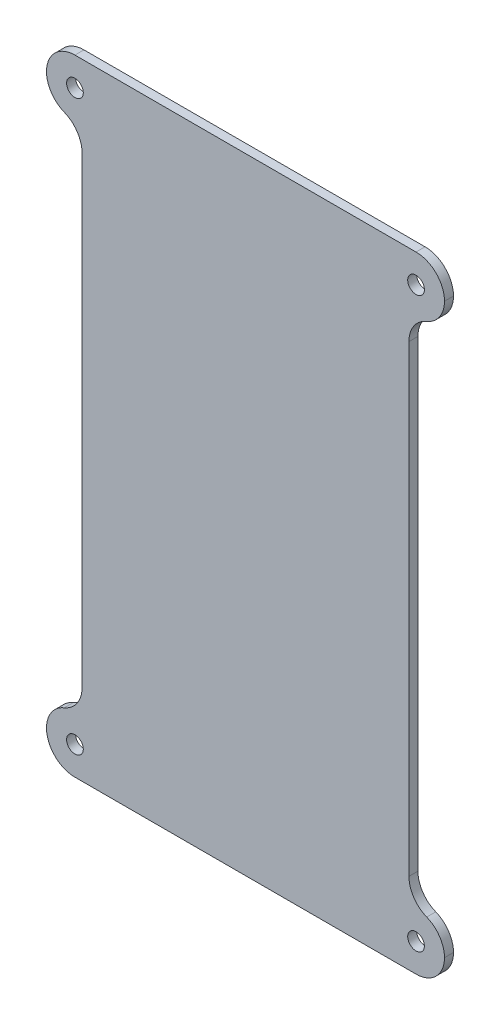
ISO-10303-21;
HEADER;
FILE_DESCRIPTION(('STEP AP214'),'2;1');
FILE_NAME('part.step','',(''),(''),'','','');
FILE_SCHEMA(('AUTOMOTIVE_DESIGN { 1 0 10303 214 1 1 1 1 }'));
ENDSEC;
DATA;
#1=APPLICATION_CONTEXT('core data for automotive mechanical design processes');
#2=APPLICATION_PROTOCOL_DEFINITION('international standard','automotive_design',2000,#1);
#3=PRODUCT_CONTEXT('',#1,'mechanical');
#4=PRODUCT('Part','Part','',(#3));
#5=PRODUCT_RELATED_PRODUCT_CATEGORY('part','',(#4));
#6=PRODUCT_DEFINITION_FORMATION('','',#4);
#7=PRODUCT_DEFINITION_CONTEXT('part definition',#1,'design');
#8=PRODUCT_DEFINITION('design','',#6,#7);
#9=PRODUCT_DEFINITION_SHAPE('','',#8);
#10=(LENGTH_UNIT() NAMED_UNIT(*) SI_UNIT(.MILLI.,.METRE.));
#11=(NAMED_UNIT(*) PLANE_ANGLE_UNIT() SI_UNIT($,.RADIAN.));
#12=(NAMED_UNIT(*) SI_UNIT($,.STERADIAN.) SOLID_ANGLE_UNIT());
#13=UNCERTAINTY_MEASURE_WITH_UNIT(LENGTH_MEASURE(1.E-05),#10,'distance_accuracy_value','');
#14=(GEOMETRIC_REPRESENTATION_CONTEXT(3) GLOBAL_UNCERTAINTY_ASSIGNED_CONTEXT((#13)) GLOBAL_UNIT_ASSIGNED_CONTEXT((#10,
#11,#12)) REPRESENTATION_CONTEXT('',''));
#15=CARTESIAN_POINT('',(0.,0.,0.));
#16=DIRECTION('',(0.,0.,1.));
#17=DIRECTION('',(1.,0.,0.));
#18=AXIS2_PLACEMENT_3D('',#15,#16,#17);
#19=CARTESIAN_POINT('',(0.,0.,2.54));
#20=DIRECTION('',(0.,0.,-1.));
#21=DIRECTION('',(-1.,0.,0.));
#22=AXIS2_PLACEMENT_3D('',#19,#20,#21);
#23=PLANE('',#22);
#24=DIRECTION('',(0.,1.,0.));
#25=VECTOR('',#24,1.);
#26=CARTESIAN_POINT('',(-46.,72.,2.54));
#27=LINE('',#26,#25);
#28=CARTESIAN_POINT('',(-46.,-65.1676030258087,2.54));
#29=VERTEX_POINT('',#28);
#30=CARTESIAN_POINT('',(-46.,65.1676030258087,2.54));
#31=VERTEX_POINT('',#30);
#32=EDGE_CURVE('E283',#29,#31,#27,.T.);
#33=ORIENTED_EDGE('',*,*,#32,.F.);
#34=CARTESIAN_POINT('',(-54.,-65.1676030258087,2.54));
#35=DIRECTION('',(0.,0.,-1.));
#36=DIRECTION('',(-1.,0.,0.));
#37=AXIS2_PLACEMENT_3D('',#34,#35,#36);
#38=CIRCLE('',#37,8.);
#39=CARTESIAN_POINT('',(-51.,-72.5838015129043,2.54));
#40=VERTEX_POINT('',#39);
#41=EDGE_CURVE('E45',#29,#40,#38,.T.);
#42=ORIENTED_EDGE('',*,*,#41,.T.);
#43=CARTESIAN_POINT('',(-48.,-80.,2.54));
#44=DIRECTION('',(0.,0.,-1.));
#45=DIRECTION('',(-1.,0.,0.));
#46=AXIS2_PLACEMENT_3D('',#43,#44,#45);
#47=CIRCLE('',#46,8.);
#48=CARTESIAN_POINT('',(-56.,-80.,2.54));
#49=VERTEX_POINT('',#48);
#50=EDGE_CURVE('E238',#40,#49,#47,.F.);
#51=ORIENTED_EDGE('',*,*,#50,.T.);
#52=CARTESIAN_POINT('',(-48.,-80.,2.54));
#53=DIRECTION('',(0.,0.,-1.));
#54=DIRECTION('',(-1.,0.,0.));
#55=AXIS2_PLACEMENT_3D('',#52,#53,#54);
#56=CIRCLE('',#55,8.);
#57=CARTESIAN_POINT('',(-48.,-88.,2.54));
#58=VERTEX_POINT('',#57);
#59=EDGE_CURVE('E202',#49,#58,#56,.F.);
#60=ORIENTED_EDGE('',*,*,#59,.T.);
#61=DIRECTION('',(1.,0.,0.));
#62=VECTOR('',#61,1.);
#63=CARTESIAN_POINT('',(-56.,-88.,2.54));
#64=LINE('',#63,#62);
#65=CARTESIAN_POINT('',(48.,-88.,2.54));
#66=VERTEX_POINT('',#65);
#67=EDGE_CURVE('E168',#58,#66,#64,.T.);
#68=ORIENTED_EDGE('',*,*,#67,.T.);
#69=CARTESIAN_POINT('',(48.,-80.,2.54));
#70=DIRECTION('',(0.,0.,-1.));
#71=DIRECTION('',(-1.,0.,0.));
#72=AXIS2_PLACEMENT_3D('',#69,#70,#71);
#73=CIRCLE('',#72,8.);
#74=CARTESIAN_POINT('',(56.,-80.,2.54));
#75=VERTEX_POINT('',#74);
#76=EDGE_CURVE('E199',#66,#75,#73,.F.);
#77=ORIENTED_EDGE('',*,*,#76,.T.);
#78=CARTESIAN_POINT('',(48.,-80.,2.54));
#79=DIRECTION('',(0.,0.,-1.));
#80=DIRECTION('',(-1.,0.,0.));
#81=AXIS2_PLACEMENT_3D('',#78,#79,#80);
#82=CIRCLE('',#81,8.);
#83=CARTESIAN_POINT('',(51.,-72.5838015129044,2.54));
#84=VERTEX_POINT('',#83);
#85=EDGE_CURVE('E235',#75,#84,#82,.F.);
#86=ORIENTED_EDGE('',*,*,#85,.T.);
#87=CARTESIAN_POINT('',(54.,-65.1676030258087,2.54));
#88=DIRECTION('',(0.,0.,-1.));
#89=DIRECTION('',(-1.,0.,0.));
#90=AXIS2_PLACEMENT_3D('',#87,#88,#89);
#91=CIRCLE('',#90,8.);
#92=CARTESIAN_POINT('',(46.,-65.1676030258087,2.54));
#93=VERTEX_POINT('',#92);
#94=EDGE_CURVE('E259',#84,#93,#91,.T.);
#95=ORIENTED_EDGE('',*,*,#94,.T.);
#96=DIRECTION('',(0.,-1.,0.));
#97=VECTOR('',#96,1.);
#98=CARTESIAN_POINT('',(46.,72.0000000000001,2.54));
#99=LINE('',#98,#97);
#100=CARTESIAN_POINT('',(46.,65.1676030258087,2.54));
#101=VERTEX_POINT('',#100);
#102=EDGE_CURVE('E288',#101,#93,#99,.T.);
#103=ORIENTED_EDGE('',*,*,#102,.F.);
#104=CARTESIAN_POINT('',(54.,65.1676030258087,2.54));
#105=DIRECTION('',(0.,0.,-1.));
#106=DIRECTION('',(-1.,0.,0.));
#107=AXIS2_PLACEMENT_3D('',#104,#105,#106);
#108=CIRCLE('',#107,8.);
#109=CARTESIAN_POINT('',(51.,72.5838015129044,2.54));
#110=VERTEX_POINT('',#109);
#111=EDGE_CURVE('E263',#101,#110,#108,.T.);
#112=ORIENTED_EDGE('',*,*,#111,.T.);
#113=CARTESIAN_POINT('',(48.,80.0000000000001,2.54));
#114=DIRECTION('',(0.,0.,-1.));
#115=DIRECTION('',(-1.,0.,0.));
#116=AXIS2_PLACEMENT_3D('',#113,#114,#115);
#117=CIRCLE('',#116,8.);
#118=CARTESIAN_POINT('',(56.,80.,2.54));
#119=VERTEX_POINT('',#118);
#120=EDGE_CURVE('E233',#110,#119,#117,.F.);
#121=ORIENTED_EDGE('',*,*,#120,.T.);
#122=CARTESIAN_POINT('',(48.,80.,2.54));
#123=DIRECTION('',(0.,0.,-1.));
#124=DIRECTION('',(-1.,0.,0.));
#125=AXIS2_PLACEMENT_3D('',#122,#123,#124);
#126=CIRCLE('',#125,8.);
#127=CARTESIAN_POINT('',(48.,88.,2.54));
#128=VERTEX_POINT('',#127);
#129=EDGE_CURVE('E197',#119,#128,#126,.F.);
#130=ORIENTED_EDGE('',*,*,#129,.T.);
#131=DIRECTION('',(-1.,0.,0.));
#132=VECTOR('',#131,1.);
#133=CARTESIAN_POINT('',(-56.,88.,2.54));
#134=LINE('',#133,#132);
#135=CARTESIAN_POINT('',(-48.,88.,2.54));
#136=VERTEX_POINT('',#135);
#137=EDGE_CURVE('E175',#128,#136,#134,.T.);
#138=ORIENTED_EDGE('',*,*,#137,.T.);
#139=CARTESIAN_POINT('',(-48.,80.,2.54));
#140=DIRECTION('',(0.,0.,-1.));
#141=DIRECTION('',(-1.,0.,0.));
#142=AXIS2_PLACEMENT_3D('',#139,#140,#141);
#143=CIRCLE('',#142,8.);
#144=CARTESIAN_POINT('',(-56.,80.,2.54));
#145=VERTEX_POINT('',#144);
#146=EDGE_CURVE('E194',#136,#145,#143,.F.);
#147=ORIENTED_EDGE('',*,*,#146,.T.);
#148=CARTESIAN_POINT('',(-48.,80.,2.54));
#149=DIRECTION('',(0.,0.,-1.));
#150=DIRECTION('',(-1.,0.,0.));
#151=AXIS2_PLACEMENT_3D('',#148,#149,#150);
#152=CIRCLE('',#151,8.);
#153=CARTESIAN_POINT('',(-51.,72.5838015129043,2.54));
#154=VERTEX_POINT('',#153);
#155=EDGE_CURVE('E230',#145,#154,#152,.F.);
#156=ORIENTED_EDGE('',*,*,#155,.T.);
#157=CARTESIAN_POINT('',(-54.,65.1676030258087,2.54));
#158=DIRECTION('',(0.,0.,-1.));
#159=DIRECTION('',(-1.,0.,0.));
#160=AXIS2_PLACEMENT_3D('',#157,#158,#159);
#161=CIRCLE('',#160,8.);
#162=EDGE_CURVE('E267',#154,#31,#161,.T.);
#163=ORIENTED_EDGE('',*,*,#162,.T.);
#164=EDGE_LOOP('',(#33,#42,#51,#60,#68,#77,#86,#95,#103,#112,#121,#130,#138,#147,#156,#163));
#165=FACE_BOUND('',#164,.T.);
#166=CARTESIAN_POINT('',(-48.,80.,2.54));
#167=DIRECTION('',(0.,0.,1.));
#168=DIRECTION('',(1.,0.,0.));
#169=AXIS2_PLACEMENT_3D('',#166,#167,#168);
#170=CIRCLE('',#169,2.35);
#171=CARTESIAN_POINT('',(-45.65,80.,2.54));
#172=VERTEX_POINT('',#171);
#173=EDGE_CURVE('E181',#172,#172,#170,.T.);
#174=ORIENTED_EDGE('',*,*,#173,.F.);
#175=EDGE_LOOP('',(#174));
#176=FACE_BOUND('',#175,.T.);
#177=CARTESIAN_POINT('',(48.,80.,2.54));
#178=DIRECTION('',(0.,0.,1.));
#179=DIRECTION('',(1.,0.,0.));
#180=AXIS2_PLACEMENT_3D('',#177,#178,#179);
#181=CIRCLE('',#180,2.34999999999999);
#182=CARTESIAN_POINT('',(50.35,80.,2.54));
#183=VERTEX_POINT('',#182);
#184=EDGE_CURVE('E305',#183,#183,#181,.T.);
#185=ORIENTED_EDGE('',*,*,#184,.F.);
#186=EDGE_LOOP('',(#185));
#187=FACE_BOUND('',#186,.T.);
#188=CARTESIAN_POINT('',(48.,-80.,2.54));
#189=DIRECTION('',(0.,0.,1.));
#190=DIRECTION('',(1.,0.,0.));
#191=AXIS2_PLACEMENT_3D('',#188,#189,#190);
#192=CIRCLE('',#191,2.35);
#193=CARTESIAN_POINT('',(50.35,-80.,2.54));
#194=VERTEX_POINT('',#193);
#195=EDGE_CURVE('E299',#194,#194,#192,.T.);
#196=ORIENTED_EDGE('',*,*,#195,.F.);
#197=EDGE_LOOP('',(#196));
#198=FACE_BOUND('',#197,.T.);
#199=CARTESIAN_POINT('',(-48.,-80.,2.54));
#200=DIRECTION('',(0.,0.,1.));
#201=DIRECTION('',(1.,0.,0.));
#202=AXIS2_PLACEMENT_3D('',#199,#200,#201);
#203=CIRCLE('',#202,2.34999999999999);
#204=CARTESIAN_POINT('',(-45.65,-80.,2.54));
#205=VERTEX_POINT('',#204);
#206=EDGE_CURVE('E291',#205,#205,#203,.T.);
#207=ORIENTED_EDGE('',*,*,#206,.F.);
#208=EDGE_LOOP('',(#207));
#209=FACE_BOUND('',#208,.T.);
#210=ADVANCED_FACE('F37',(#165,#176,#187,#198,#209),#23,.F.);
#211=CARTESIAN_POINT('',(0.,0.,0.));
#212=DIRECTION('',(0.,0.,-1.));
#213=DIRECTION('',(-1.,0.,0.));
#214=AXIS2_PLACEMENT_3D('',#211,#212,#213);
#215=PLANE('',#214);
#216=CARTESIAN_POINT('',(-48.,-80.,0.));
#217=DIRECTION('',(0.,0.,-1.));
#218=DIRECTION('',(-1.,0.,0.));
#219=AXIS2_PLACEMENT_3D('',#216,#217,#218);
#220=CIRCLE('',#219,8.);
#221=CARTESIAN_POINT('',(-48.,-88.,0.));
#222=VERTEX_POINT('',#221);
#223=CARTESIAN_POINT('',(-56.,-80.,0.));
#224=VERTEX_POINT('',#223);
#225=EDGE_CURVE('E149',#222,#224,#220,.T.);
#226=ORIENTED_EDGE('',*,*,#225,.T.);
#227=CARTESIAN_POINT('',(-48.,-80.,0.));
#228=DIRECTION('',(0.,0.,-1.));
#229=DIRECTION('',(-1.,0.,0.));
#230=AXIS2_PLACEMENT_3D('',#227,#228,#229);
#231=CIRCLE('',#230,8.);
#232=CARTESIAN_POINT('',(-51.,-72.5838015129043,0.));
#233=VERTEX_POINT('',#232);
#234=EDGE_CURVE('E228',#224,#233,#231,.T.);
#235=ORIENTED_EDGE('',*,*,#234,.T.);
#236=CARTESIAN_POINT('',(-54.,-65.1676030258087,0.));
#237=DIRECTION('',(0.,0.,-1.));
#238=DIRECTION('',(-1.,0.,0.));
#239=AXIS2_PLACEMENT_3D('',#236,#237,#238);
#240=CIRCLE('',#239,8.);
#241=CARTESIAN_POINT('',(-46.,-65.1676030258087,0.));
#242=VERTEX_POINT('',#241);
#243=EDGE_CURVE('E11',#233,#242,#240,.F.);
#244=ORIENTED_EDGE('',*,*,#243,.T.);
#245=DIRECTION('',(0.,-1.,0.));
#246=VECTOR('',#245,1.);
#247=CARTESIAN_POINT('',(-46.,0.,0.));
#248=LINE('',#247,#246);
#249=CARTESIAN_POINT('',(-46.,65.1676030258087,0.));
#250=VERTEX_POINT('',#249);
#251=EDGE_CURVE('E218',#250,#242,#248,.T.);
#252=ORIENTED_EDGE('',*,*,#251,.F.);
#253=CARTESIAN_POINT('',(-54.,65.1676030258087,0.));
#254=DIRECTION('',(0.,0.,-1.));
#255=DIRECTION('',(-1.,0.,0.));
#256=AXIS2_PLACEMENT_3D('',#253,#254,#255);
#257=CIRCLE('',#256,8.);
#258=CARTESIAN_POINT('',(-51.,72.5838015129043,0.));
#259=VERTEX_POINT('',#258);
#260=EDGE_CURVE('E269',#250,#259,#257,.F.);
#261=ORIENTED_EDGE('',*,*,#260,.T.);
#262=CARTESIAN_POINT('',(-48.,80.,0.));
#263=DIRECTION('',(0.,0.,-1.));
#264=DIRECTION('',(-1.,0.,0.));
#265=AXIS2_PLACEMENT_3D('',#262,#263,#264);
#266=CIRCLE('',#265,8.);
#267=CARTESIAN_POINT('',(-56.,80.,0.));
#268=VERTEX_POINT('',#267);
#269=EDGE_CURVE('E221',#259,#268,#266,.T.);
#270=ORIENTED_EDGE('',*,*,#269,.T.);
#271=CARTESIAN_POINT('',(-48.,80.,0.));
#272=DIRECTION('',(0.,0.,-1.));
#273=DIRECTION('',(-1.,0.,0.));
#274=AXIS2_PLACEMENT_3D('',#271,#272,#273);
#275=CIRCLE('',#274,8.);
#276=CARTESIAN_POINT('',(-48.,88.,0.));
#277=VERTEX_POINT('',#276);
#278=EDGE_CURVE('E169',#268,#277,#275,.T.);
#279=ORIENTED_EDGE('',*,*,#278,.T.);
#280=DIRECTION('',(-1.,0.,0.));
#281=VECTOR('',#280,1.);
#282=CARTESIAN_POINT('',(-56.,88.,0.));
#283=LINE('',#282,#281);
#284=CARTESIAN_POINT('',(48.,88.,0.));
#285=VERTEX_POINT('',#284);
#286=EDGE_CURVE('E176',#285,#277,#283,.T.);
#287=ORIENTED_EDGE('',*,*,#286,.F.);
#288=CARTESIAN_POINT('',(48.,80.,0.));
#289=DIRECTION('',(0.,0.,-1.));
#290=DIRECTION('',(-1.,0.,0.));
#291=AXIS2_PLACEMENT_3D('',#288,#289,#290);
#292=CIRCLE('',#291,8.);
#293=CARTESIAN_POINT('',(56.,80.,0.));
#294=VERTEX_POINT('',#293);
#295=EDGE_CURVE('E187',#285,#294,#292,.T.);
#296=ORIENTED_EDGE('',*,*,#295,.T.);
#297=CARTESIAN_POINT('',(48.,80.0000000000001,0.));
#298=DIRECTION('',(0.,0.,-1.));
#299=DIRECTION('',(-1.,0.,0.));
#300=AXIS2_PLACEMENT_3D('',#297,#298,#299);
#301=CIRCLE('',#300,8.);
#302=CARTESIAN_POINT('',(51.,72.5838015129044,0.));
#303=VERTEX_POINT('',#302);
#304=EDGE_CURVE('E223',#294,#303,#301,.T.);
#305=ORIENTED_EDGE('',*,*,#304,.T.);
#306=CARTESIAN_POINT('',(54.,65.1676030258087,0.));
#307=DIRECTION('',(0.,0.,-1.));
#308=DIRECTION('',(-1.,0.,0.));
#309=AXIS2_PLACEMENT_3D('',#306,#307,#308);
#310=CIRCLE('',#309,8.);
#311=CARTESIAN_POINT('',(46.,65.1676030258087,0.));
#312=VERTEX_POINT('',#311);
#313=EDGE_CURVE('E265',#303,#312,#310,.F.);
#314=ORIENTED_EDGE('',*,*,#313,.T.);
#315=DIRECTION('',(0.,1.,0.));
#316=VECTOR('',#315,1.);
#317=CARTESIAN_POINT('',(46.,0.,0.));
#318=LINE('',#317,#316);
#319=CARTESIAN_POINT('',(46.,-65.1676030258087,0.));
#320=VERTEX_POINT('',#319);
#321=EDGE_CURVE('E215',#320,#312,#318,.T.);
#322=ORIENTED_EDGE('',*,*,#321,.F.);
#323=CARTESIAN_POINT('',(54.,-65.1676030258087,0.));
#324=DIRECTION('',(0.,0.,-1.));
#325=DIRECTION('',(-1.,0.,0.));
#326=AXIS2_PLACEMENT_3D('',#323,#324,#325);
#327=CIRCLE('',#326,8.);
#328=CARTESIAN_POINT('',(51.,-72.5838015129044,0.));
#329=VERTEX_POINT('',#328);
#330=EDGE_CURVE('E261',#320,#329,#327,.F.);
#331=ORIENTED_EDGE('',*,*,#330,.T.);
#332=CARTESIAN_POINT('',(48.,-80.,0.));
#333=DIRECTION('',(0.,0.,-1.));
#334=DIRECTION('',(-1.,0.,0.));
#335=AXIS2_PLACEMENT_3D('',#332,#333,#334);
#336=CIRCLE('',#335,8.);
#337=CARTESIAN_POINT('',(56.,-80.,0.));
#338=VERTEX_POINT('',#337);
#339=EDGE_CURVE('E226',#329,#338,#336,.T.);
#340=ORIENTED_EDGE('',*,*,#339,.T.);
#341=CARTESIAN_POINT('',(48.,-80.,0.));
#342=DIRECTION('',(0.,0.,-1.));
#343=DIRECTION('',(-1.,0.,0.));
#344=AXIS2_PLACEMENT_3D('',#341,#342,#343);
#345=CIRCLE('',#344,8.);
#346=CARTESIAN_POINT('',(48.,-88.,0.));
#347=VERTEX_POINT('',#346);
#348=EDGE_CURVE('E159',#338,#347,#345,.T.);
#349=ORIENTED_EDGE('',*,*,#348,.T.);
#350=DIRECTION('',(1.,0.,0.));
#351=VECTOR('',#350,1.);
#352=CARTESIAN_POINT('',(-56.,-88.,0.));
#353=LINE('',#352,#351);
#354=EDGE_CURVE('E165',#222,#347,#353,.T.);
#355=ORIENTED_EDGE('',*,*,#354,.F.);
#356=EDGE_LOOP('',(#226,#235,#244,#252,#261,#270,#279,#287,#296,#305,#314,#322,#331,#340,#349,#355));
#357=FACE_BOUND('',#356,.T.);
#358=CARTESIAN_POINT('',(48.,-80.,0.));
#359=DIRECTION('',(0.,0.,1.));
#360=DIRECTION('',(1.,0.,0.));
#361=AXIS2_PLACEMENT_3D('',#358,#359,#360);
#362=CIRCLE('',#361,2.35);
#363=CARTESIAN_POINT('',(50.35,-80.,0.));
#364=VERTEX_POINT('',#363);
#365=EDGE_CURVE('E297',#364,#364,#362,.T.);
#366=ORIENTED_EDGE('',*,*,#365,.T.);
#367=EDGE_LOOP('',(#366));
#368=FACE_BOUND('',#367,.T.);
#369=CARTESIAN_POINT('',(-48.,80.,0.));
#370=DIRECTION('',(0.,0.,1.));
#371=DIRECTION('',(1.,0.,0.));
#372=AXIS2_PLACEMENT_3D('',#369,#370,#371);
#373=CIRCLE('',#372,2.35);
#374=CARTESIAN_POINT('',(-45.65,80.,0.));
#375=VERTEX_POINT('',#374);
#376=EDGE_CURVE('E308',#375,#375,#373,.T.);
#377=ORIENTED_EDGE('',*,*,#376,.T.);
#378=EDGE_LOOP('',(#377));
#379=FACE_BOUND('',#378,.T.);
#380=CARTESIAN_POINT('',(48.,80.,0.));
#381=DIRECTION('',(0.,0.,1.));
#382=DIRECTION('',(1.,0.,0.));
#383=AXIS2_PLACEMENT_3D('',#380,#381,#382);
#384=CIRCLE('',#383,2.34999999999999);
#385=CARTESIAN_POINT('',(50.35,80.,0.));
#386=VERTEX_POINT('',#385);
#387=EDGE_CURVE('E302',#386,#386,#384,.T.);
#388=ORIENTED_EDGE('',*,*,#387,.T.);
#389=EDGE_LOOP('',(#388));
#390=FACE_BOUND('',#389,.T.);
#391=CARTESIAN_POINT('',(-48.,-80.,0.));
#392=DIRECTION('',(0.,0.,1.));
#393=DIRECTION('',(1.,0.,0.));
#394=AXIS2_PLACEMENT_3D('',#391,#392,#393);
#395=CIRCLE('',#394,2.34999999999999);
#396=CARTESIAN_POINT('',(-45.65,-80.,0.));
#397=VERTEX_POINT('',#396);
#398=EDGE_CURVE('E287',#397,#397,#395,.T.);
#399=ORIENTED_EDGE('',*,*,#398,.T.);
#400=EDGE_LOOP('',(#399));
#401=FACE_BOUND('',#400,.T.);
#402=ADVANCED_FACE('F172',(#357,#368,#379,#390,#401),#215,.T.);
#403=CARTESIAN_POINT('',(-56.,88.,2.54));
#404=DIRECTION('',(0.,-1.,0.));
#405=DIRECTION('',(0.,0.,-1.));
#406=AXIS2_PLACEMENT_3D('',#403,#404,#405);
#407=PLANE('',#406);
#408=ORIENTED_EDGE('',*,*,#137,.F.);
#409=DIRECTION('',(0.,0.,-1.));
#410=VECTOR('',#409,1.);
#411=CARTESIAN_POINT('',(48.,88.,2.54));
#412=LINE('',#411,#410);
#413=EDGE_CURVE('E212',#128,#285,#412,.T.);
#414=ORIENTED_EDGE('',*,*,#413,.T.);
#415=ORIENTED_EDGE('',*,*,#286,.T.);
#416=DIRECTION('',(0.,0.,-1.));
#417=VECTOR('',#416,1.);
#418=CARTESIAN_POINT('',(-48.,88.,2.54));
#419=LINE('',#418,#417);
#420=EDGE_CURVE('E210',#277,#136,#419,.F.);
#421=ORIENTED_EDGE('',*,*,#420,.T.);
#422=EDGE_LOOP('',(#408,#414,#415,#421));
#423=FACE_BOUND('',#422,.T.);
#424=ADVANCED_FACE('F346',(#423),#407,.F.);
#425=CARTESIAN_POINT('',(-56.,-88.,2.54));
#426=DIRECTION('',(0.,1.,0.));
#427=DIRECTION('',(0.,0.,1.));
#428=AXIS2_PLACEMENT_3D('',#425,#426,#427);
#429=PLANE('',#428);
#430=ORIENTED_EDGE('',*,*,#67,.F.);
#431=DIRECTION('',(0.,0.,-1.));
#432=VECTOR('',#431,1.);
#433=CARTESIAN_POINT('',(-48.,-88.,2.54));
#434=LINE('',#433,#432);
#435=EDGE_CURVE('E153',#58,#222,#434,.T.);
#436=ORIENTED_EDGE('',*,*,#435,.T.);
#437=ORIENTED_EDGE('',*,*,#354,.T.);
#438=DIRECTION('',(0.,0.,-1.));
#439=VECTOR('',#438,1.);
#440=CARTESIAN_POINT('',(48.,-88.,2.54));
#441=LINE('',#440,#439);
#442=EDGE_CURVE('E170',#347,#66,#441,.F.);
#443=ORIENTED_EDGE('',*,*,#442,.T.);
#444=EDGE_LOOP('',(#430,#436,#437,#443));
#445=FACE_BOUND('',#444,.T.);
#446=ADVANCED_FACE('F164',(#445),#429,.F.);
#447=CARTESIAN_POINT('',(-48.,80.,2.54));
#448=DIRECTION('',(0.,0.,-1.));
#449=DIRECTION('',(-1.,0.,0.));
#450=AXIS2_PLACEMENT_3D('',#447,#448,#449);
#451=CYLINDRICAL_SURFACE('',#450,2.35);
#452=ORIENTED_EDGE('',*,*,#173,.T.);
#453=EDGE_LOOP('',(#452));
#454=FACE_BOUND('',#453,.T.);
#455=ORIENTED_EDGE('',*,*,#376,.F.);
#456=EDGE_LOOP('',(#455));
#457=FACE_BOUND('',#456,.T.);
#458=ADVANCED_FACE('F367',(#454,#457),#451,.F.);
#459=CARTESIAN_POINT('',(48.,80.,2.54));
#460=DIRECTION('',(0.,0.,-1.));
#461=DIRECTION('',(-1.,0.,0.));
#462=AXIS2_PLACEMENT_3D('',#459,#460,#461);
#463=CYLINDRICAL_SURFACE('',#462,2.34999999999999);
#464=ORIENTED_EDGE('',*,*,#184,.T.);
#465=EDGE_LOOP('',(#464));
#466=FACE_BOUND('',#465,.T.);
#467=ORIENTED_EDGE('',*,*,#387,.F.);
#468=EDGE_LOOP('',(#467));
#469=FACE_BOUND('',#468,.T.);
#470=ADVANCED_FACE('F520',(#466,#469),#463,.F.);
#471=CARTESIAN_POINT('',(48.,-80.,2.54));
#472=DIRECTION('',(0.,0.,-1.));
#473=DIRECTION('',(-1.,0.,0.));
#474=AXIS2_PLACEMENT_3D('',#471,#472,#473);
#475=CYLINDRICAL_SURFACE('',#474,2.35);
#476=ORIENTED_EDGE('',*,*,#195,.T.);
#477=EDGE_LOOP('',(#476));
#478=FACE_BOUND('',#477,.T.);
#479=ORIENTED_EDGE('',*,*,#365,.F.);
#480=EDGE_LOOP('',(#479));
#481=FACE_BOUND('',#480,.T.);
#482=ADVANCED_FACE('F510',(#478,#481),#475,.F.);
#483=CARTESIAN_POINT('',(-48.,-80.,2.54));
#484=DIRECTION('',(0.,0.,-1.));
#485=DIRECTION('',(-1.,0.,0.));
#486=AXIS2_PLACEMENT_3D('',#483,#484,#485);
#487=CYLINDRICAL_SURFACE('',#486,2.34999999999999);
#488=ORIENTED_EDGE('',*,*,#206,.T.);
#489=EDGE_LOOP('',(#488));
#490=FACE_BOUND('',#489,.T.);
#491=ORIENTED_EDGE('',*,*,#398,.F.);
#492=EDGE_LOOP('',(#491));
#493=FACE_BOUND('',#492,.T.);
#494=ADVANCED_FACE('F376',(#490,#493),#487,.F.);
#495=CARTESIAN_POINT('',(-48.,-80.,2.54));
#496=DIRECTION('',(0.,0.,-1.));
#497=DIRECTION('',(-1.,0.,0.));
#498=AXIS2_PLACEMENT_3D('',#495,#496,#497);
#499=CYLINDRICAL_SURFACE('',#498,8.);
#500=ORIENTED_EDGE('',*,*,#59,.F.);
#501=DIRECTION('',(0.,0.,-1.));
#502=VECTOR('',#501,1.);
#503=CARTESIAN_POINT('',(-56.,-80.,2.54));
#504=LINE('',#503,#502);
#505=EDGE_CURVE('E155',#224,#49,#504,.F.);
#506=ORIENTED_EDGE('',*,*,#505,.F.);
#507=ORIENTED_EDGE('',*,*,#225,.F.);
#508=ORIENTED_EDGE('',*,*,#435,.F.);
#509=EDGE_LOOP('',(#500,#506,#507,#508));
#510=FACE_BOUND('',#509,.T.);
#511=ADVANCED_FACE('F152',(#510),#499,.T.);
#512=CARTESIAN_POINT('',(48.,-80.,2.54));
#513=DIRECTION('',(0.,0.,-1.));
#514=DIRECTION('',(-1.,0.,0.));
#515=AXIS2_PLACEMENT_3D('',#512,#513,#514);
#516=CYLINDRICAL_SURFACE('',#515,8.);
#517=ORIENTED_EDGE('',*,*,#76,.F.);
#518=ORIENTED_EDGE('',*,*,#442,.F.);
#519=ORIENTED_EDGE('',*,*,#348,.F.);
#520=DIRECTION('',(0.,0.,-1.));
#521=VECTOR('',#520,1.);
#522=CARTESIAN_POINT('',(56.,-80.,2.54));
#523=LINE('',#522,#521);
#524=EDGE_CURVE('E207',#75,#338,#523,.T.);
#525=ORIENTED_EDGE('',*,*,#524,.F.);
#526=EDGE_LOOP('',(#517,#518,#519,#525));
#527=FACE_BOUND('',#526,.T.);
#528=ADVANCED_FACE('F317',(#527),#516,.T.);
#529=CARTESIAN_POINT('',(48.,80.,2.54));
#530=DIRECTION('',(0.,0.,-1.));
#531=DIRECTION('',(-1.,0.,0.));
#532=AXIS2_PLACEMENT_3D('',#529,#530,#531);
#533=CYLINDRICAL_SURFACE('',#532,8.);
#534=ORIENTED_EDGE('',*,*,#129,.F.);
#535=DIRECTION('',(0.,0.,-1.));
#536=VECTOR('',#535,1.);
#537=CARTESIAN_POINT('',(56.,80.,2.54));
#538=LINE('',#537,#536);
#539=EDGE_CURVE('E204',#294,#119,#538,.F.);
#540=ORIENTED_EDGE('',*,*,#539,.F.);
#541=ORIENTED_EDGE('',*,*,#295,.F.);
#542=ORIENTED_EDGE('',*,*,#413,.F.);
#543=EDGE_LOOP('',(#534,#540,#541,#542));
#544=FACE_BOUND('',#543,.T.);
#545=ADVANCED_FACE('F341',(#544),#533,.T.);
#546=CARTESIAN_POINT('',(-48.,80.,2.54));
#547=DIRECTION('',(0.,0.,-1.));
#548=DIRECTION('',(-1.,0.,0.));
#549=AXIS2_PLACEMENT_3D('',#546,#547,#548);
#550=CYLINDRICAL_SURFACE('',#549,8.);
#551=ORIENTED_EDGE('',*,*,#146,.F.);
#552=ORIENTED_EDGE('',*,*,#420,.F.);
#553=ORIENTED_EDGE('',*,*,#278,.F.);
#554=DIRECTION('',(0.,0.,-1.));
#555=VECTOR('',#554,1.);
#556=CARTESIAN_POINT('',(-56.,80.,2.54));
#557=LINE('',#556,#555);
#558=EDGE_CURVE('E158',#145,#268,#557,.T.);
#559=ORIENTED_EDGE('',*,*,#558,.F.);
#560=EDGE_LOOP('',(#551,#552,#553,#559));
#561=FACE_BOUND('',#560,.T.);
#562=ADVANCED_FACE('F350',(#561),#550,.T.);
#563=CARTESIAN_POINT('',(-46.,72.,-0.64));
#564=DIRECTION('',(1.,0.,0.));
#565=DIRECTION('',(0.,1.,0.));
#566=AXIS2_PLACEMENT_3D('',#563,#564,#565);
#567=PLANE('',#566);
#568=ORIENTED_EDGE('',*,*,#32,.T.);
#569=DIRECTION('',(0.,0.,1.));
#570=VECTOR('',#569,1.);
#571=CARTESIAN_POINT('',(-46.,65.1676030258087,-0.64));
#572=LINE('',#571,#570);
#573=EDGE_CURVE('E256',#31,#250,#572,.F.);
#574=ORIENTED_EDGE('',*,*,#573,.T.);
#575=ORIENTED_EDGE('',*,*,#251,.T.);
#576=DIRECTION('',(0.,0.,-1.));
#577=VECTOR('',#576,1.);
#578=CARTESIAN_POINT('',(-46.,-65.1676030258087,-0.64));
#579=LINE('',#578,#577);
#580=EDGE_CURVE('E253',#242,#29,#579,.F.);
#581=ORIENTED_EDGE('',*,*,#580,.T.);
#582=EDGE_LOOP('',(#568,#574,#575,#581));
#583=FACE_BOUND('',#582,.T.);
#584=ADVANCED_FACE('F285',(#583),#567,.F.);
#585=CARTESIAN_POINT('',(46.,72.0000000000001,-0.64));
#586=DIRECTION('',(-1.,0.,0.));
#587=DIRECTION('',(0.,-1.,0.));
#588=AXIS2_PLACEMENT_3D('',#585,#586,#587);
#589=PLANE('',#588);
#590=ORIENTED_EDGE('',*,*,#102,.T.);
#591=DIRECTION('',(0.,0.,1.));
#592=VECTOR('',#591,1.);
#593=CARTESIAN_POINT('',(46.,-65.1676030258087,-0.64));
#594=LINE('',#593,#592);
#595=EDGE_CURVE('E246',#93,#320,#594,.F.);
#596=ORIENTED_EDGE('',*,*,#595,.T.);
#597=ORIENTED_EDGE('',*,*,#321,.T.);
#598=DIRECTION('',(0.,0.,-1.));
#599=VECTOR('',#598,1.);
#600=CARTESIAN_POINT('',(46.,65.1676030258087,-0.64));
#601=LINE('',#600,#599);
#602=EDGE_CURVE('E243',#312,#101,#601,.F.);
#603=ORIENTED_EDGE('',*,*,#602,.T.);
#604=EDGE_LOOP('',(#590,#596,#597,#603));
#605=FACE_BOUND('',#604,.T.);
#606=ADVANCED_FACE('F326',(#605),#589,.F.);
#607=CARTESIAN_POINT('',(-48.,-80.,2.54));
#608=DIRECTION('',(0.,0.,-1.));
#609=DIRECTION('',(-1.,0.,0.));
#610=AXIS2_PLACEMENT_3D('',#607,#608,#609);
#611=CYLINDRICAL_SURFACE('',#610,8.);
#612=ORIENTED_EDGE('',*,*,#50,.F.);
#613=DIRECTION('',(0.,0.,-1.));
#614=VECTOR('',#613,1.);
#615=CARTESIAN_POINT('',(-51.,-72.5838015129043,2.54));
#616=LINE('',#615,#614);
#617=EDGE_CURVE('E52',#40,#233,#616,.T.);
#618=ORIENTED_EDGE('',*,*,#617,.T.);
#619=ORIENTED_EDGE('',*,*,#234,.F.);
#620=ORIENTED_EDGE('',*,*,#505,.T.);
#621=EDGE_LOOP('',(#612,#618,#619,#620));
#622=FACE_BOUND('',#621,.T.);
#623=ADVANCED_FACE('F405',(#622),#611,.T.);
#624=CARTESIAN_POINT('',(48.,-80.,2.54));
#625=DIRECTION('',(0.,0.,1.));
#626=DIRECTION('',(1.,0.,0.));
#627=AXIS2_PLACEMENT_3D('',#624,#625,#626);
#628=CYLINDRICAL_SURFACE('',#627,8.);
#629=ORIENTED_EDGE('',*,*,#339,.F.);
#630=DIRECTION('',(0.,0.,1.));
#631=VECTOR('',#630,1.);
#632=CARTESIAN_POINT('',(51.,-72.5838015129044,2.54));
#633=LINE('',#632,#631);
#634=EDGE_CURVE('E240',#329,#84,#633,.T.);
#635=ORIENTED_EDGE('',*,*,#634,.T.);
#636=ORIENTED_EDGE('',*,*,#85,.F.);
#637=ORIENTED_EDGE('',*,*,#524,.T.);
#638=EDGE_LOOP('',(#629,#635,#636,#637));
#639=FACE_BOUND('',#638,.T.);
#640=ADVANCED_FACE('F320',(#639),#628,.T.);
#641=CARTESIAN_POINT('',(48.,80.0000000000001,2.54));
#642=DIRECTION('',(0.,0.,-1.));
#643=DIRECTION('',(-1.,0.,0.));
#644=AXIS2_PLACEMENT_3D('',#641,#642,#643);
#645=CYLINDRICAL_SURFACE('',#644,8.);
#646=ORIENTED_EDGE('',*,*,#120,.F.);
#647=DIRECTION('',(0.,0.,-1.));
#648=VECTOR('',#647,1.);
#649=CARTESIAN_POINT('',(51.,72.5838015129044,2.54));
#650=LINE('',#649,#648);
#651=EDGE_CURVE('E248',#110,#303,#650,.T.);
#652=ORIENTED_EDGE('',*,*,#651,.T.);
#653=ORIENTED_EDGE('',*,*,#304,.F.);
#654=ORIENTED_EDGE('',*,*,#539,.T.);
#655=EDGE_LOOP('',(#646,#652,#653,#654));
#656=FACE_BOUND('',#655,.T.);
#657=ADVANCED_FACE('F338',(#656),#645,.T.);
#658=CARTESIAN_POINT('',(-48.,80.,2.54));
#659=DIRECTION('',(0.,0.,1.));
#660=DIRECTION('',(1.,0.,0.));
#661=AXIS2_PLACEMENT_3D('',#658,#659,#660);
#662=CYLINDRICAL_SURFACE('',#661,8.);
#663=ORIENTED_EDGE('',*,*,#269,.F.);
#664=DIRECTION('',(0.,0.,1.));
#665=VECTOR('',#664,1.);
#666=CARTESIAN_POINT('',(-51.,72.5838015129043,2.54));
#667=LINE('',#666,#665);
#668=EDGE_CURVE('E250',#259,#154,#667,.T.);
#669=ORIENTED_EDGE('',*,*,#668,.T.);
#670=ORIENTED_EDGE('',*,*,#155,.F.);
#671=ORIENTED_EDGE('',*,*,#558,.T.);
#672=EDGE_LOOP('',(#663,#669,#670,#671));
#673=FACE_BOUND('',#672,.T.);
#674=ADVANCED_FACE('F278',(#673),#662,.T.);
#675=CARTESIAN_POINT('',(54.,-65.1676030258087,2.54));
#676=DIRECTION('',(0.,0.,1.));
#677=DIRECTION('',(1.,0.,0.));
#678=AXIS2_PLACEMENT_3D('',#675,#676,#677);
#679=CYLINDRICAL_SURFACE('',#678,8.);
#680=ORIENTED_EDGE('',*,*,#330,.F.);
#681=ORIENTED_EDGE('',*,*,#595,.F.);
#682=ORIENTED_EDGE('',*,*,#94,.F.);
#683=ORIENTED_EDGE('',*,*,#634,.F.);
#684=EDGE_LOOP('',(#680,#681,#682,#683));
#685=FACE_BOUND('',#684,.T.);
#686=ADVANCED_FACE('F330',(#685),#679,.F.);
#687=CARTESIAN_POINT('',(54.,65.1676030258087,2.54));
#688=DIRECTION('',(0.,0.,-1.));
#689=DIRECTION('',(-1.,0.,0.));
#690=AXIS2_PLACEMENT_3D('',#687,#688,#689);
#691=CYLINDRICAL_SURFACE('',#690,8.);
#692=ORIENTED_EDGE('',*,*,#313,.F.);
#693=ORIENTED_EDGE('',*,*,#651,.F.);
#694=ORIENTED_EDGE('',*,*,#111,.F.);
#695=ORIENTED_EDGE('',*,*,#602,.F.);
#696=EDGE_LOOP('',(#692,#693,#694,#695));
#697=FACE_BOUND('',#696,.T.);
#698=ADVANCED_FACE('F333',(#697),#691,.F.);
#699=CARTESIAN_POINT('',(-54.,65.1676030258087,2.54));
#700=DIRECTION('',(0.,0.,1.));
#701=DIRECTION('',(1.,0.,0.));
#702=AXIS2_PLACEMENT_3D('',#699,#700,#701);
#703=CYLINDRICAL_SURFACE('',#702,8.);
#704=ORIENTED_EDGE('',*,*,#260,.F.);
#705=ORIENTED_EDGE('',*,*,#573,.F.);
#706=ORIENTED_EDGE('',*,*,#162,.F.);
#707=ORIENTED_EDGE('',*,*,#668,.F.);
#708=EDGE_LOOP('',(#704,#705,#706,#707));
#709=FACE_BOUND('',#708,.T.);
#710=ADVANCED_FACE('F280',(#709),#703,.F.);
#711=CARTESIAN_POINT('',(-54.,-65.1676030258087,2.54));
#712=DIRECTION('',(0.,0.,-1.));
#713=DIRECTION('',(-1.,0.,0.));
#714=AXIS2_PLACEMENT_3D('',#711,#712,#713);
#715=CYLINDRICAL_SURFACE('',#714,8.);
#716=ORIENTED_EDGE('',*,*,#243,.F.);
#717=ORIENTED_EDGE('',*,*,#617,.F.);
#718=ORIENTED_EDGE('',*,*,#41,.F.);
#719=ORIENTED_EDGE('',*,*,#580,.F.);
#720=EDGE_LOOP('',(#716,#717,#718,#719));
#721=FACE_BOUND('',#720,.T.);
#722=ADVANCED_FACE('F39',(#721),#715,.F.);
#723=CLOSED_SHELL('',(#210,#402,#424,#446,#458,#470,#482,#494,#511,#528,#545,#562,#584,#606,
#623,#640,#657,#674,#686,#698,#710,#722));
#724=MANIFOLD_SOLID_BREP('B2',#723);
#725=ADVANCED_BREP_SHAPE_REPRESENTATION('',(#18,#724),#14);
#726=SHAPE_DEFINITION_REPRESENTATION(#9,#725);
ENDSEC;
END-ISO-10303-21;
